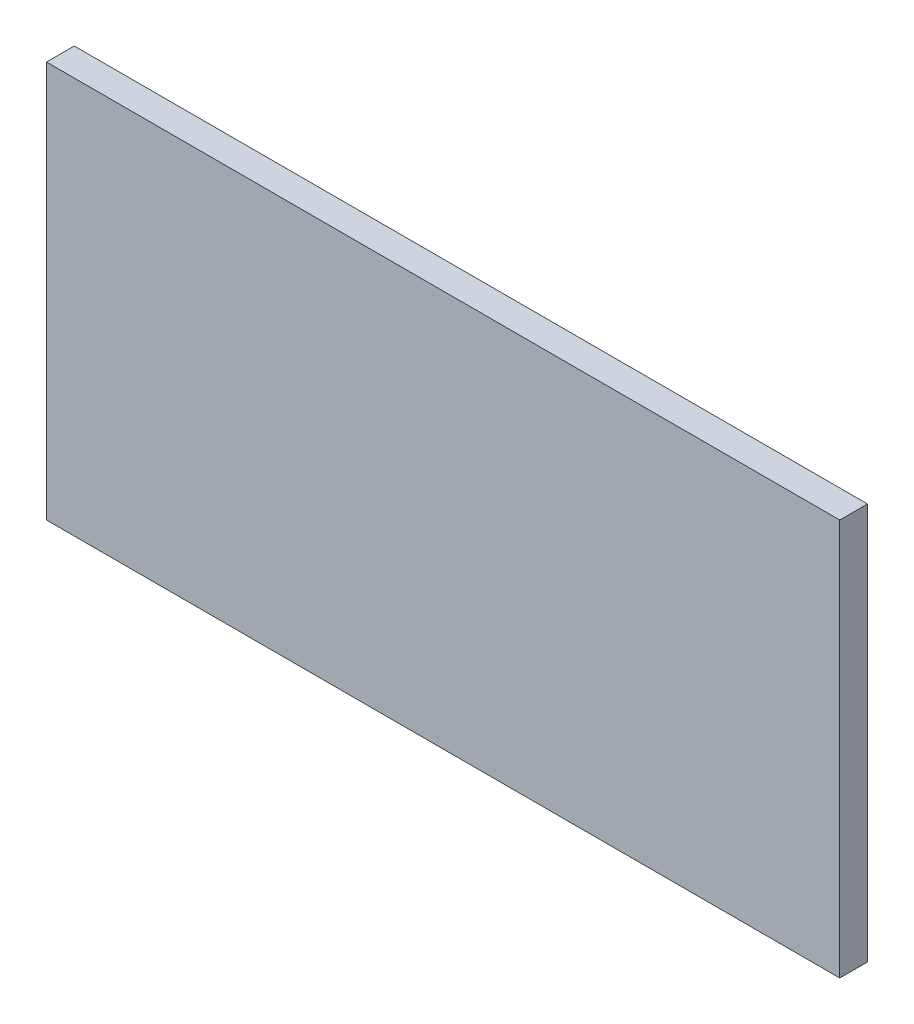
ISO-10303-21;
HEADER;
FILE_DESCRIPTION(('STEP AP214'),'2;1');
FILE_NAME('part.step','',(''),(''),'','','');
FILE_SCHEMA(('AUTOMOTIVE_DESIGN { 1 0 10303 214 1 1 1 1 }'));
ENDSEC;
DATA;
#1=APPLICATION_CONTEXT('core data for automotive mechanical design processes');
#2=APPLICATION_PROTOCOL_DEFINITION('international standard','automotive_design',2000,#1);
#3=PRODUCT_CONTEXT('',#1,'mechanical');
#4=PRODUCT('Part','Part','',(#3));
#5=PRODUCT_RELATED_PRODUCT_CATEGORY('part','',(#4));
#6=PRODUCT_DEFINITION_FORMATION('','',#4);
#7=PRODUCT_DEFINITION_CONTEXT('part definition',#1,'design');
#8=PRODUCT_DEFINITION('design','',#6,#7);
#9=PRODUCT_DEFINITION_SHAPE('','',#8);
#10=(LENGTH_UNIT() NAMED_UNIT(*) SI_UNIT(.MILLI.,.METRE.));
#11=(NAMED_UNIT(*) PLANE_ANGLE_UNIT() SI_UNIT($,.RADIAN.));
#12=(NAMED_UNIT(*) SI_UNIT($,.STERADIAN.) SOLID_ANGLE_UNIT());
#13=UNCERTAINTY_MEASURE_WITH_UNIT(LENGTH_MEASURE(1.E-05),#10,'distance_accuracy_value','');
#14=(GEOMETRIC_REPRESENTATION_CONTEXT(3) GLOBAL_UNCERTAINTY_ASSIGNED_CONTEXT((#13)) GLOBAL_UNIT_ASSIGNED_CONTEXT((#10,
#11,#12)) REPRESENTATION_CONTEXT('',''));
#15=CARTESIAN_POINT('',(0.,0.,0.));
#16=DIRECTION('',(0.,0.,1.));
#17=DIRECTION('',(1.,0.,0.));
#18=AXIS2_PLACEMENT_3D('',#15,#16,#17);
#19=CARTESIAN_POINT('',(78.46,-128.56,1.635));
#20=DIRECTION('',(0.,0.,-1.));
#21=DIRECTION('',(0.,-1.,0.));
#22=AXIS2_PLACEMENT_3D('',#19,#20,#21);
#23=PLANE('',#22);
#24=DIRECTION('',(0.,-1.,0.));
#25=VECTOR('',#24,1.);
#26=CARTESIAN_POINT('',(78.96,-128.31,1.635));
#27=LINE('',#26,#25);
#28=CARTESIAN_POINT('',(78.96,-128.31,1.635));
#29=VERTEX_POINT('',#28);
#30=CARTESIAN_POINT('',(78.96,-128.81,1.635));
#31=VERTEX_POINT('',#30);
#32=EDGE_CURVE('E27',#29,#31,#27,.T.);
#33=ORIENTED_EDGE('',*,*,#32,.F.);
#34=DIRECTION('',(1.,0.,0.));
#35=VECTOR('',#34,1.);
#36=CARTESIAN_POINT('',(77.96,-128.31,1.635));
#37=LINE('',#36,#35);
#38=CARTESIAN_POINT('',(77.96,-128.31,1.635));
#39=VERTEX_POINT('',#38);
#40=EDGE_CURVE('E95',#39,#29,#37,.T.);
#41=ORIENTED_EDGE('',*,*,#40,.F.);
#42=DIRECTION('',(0.,1.,0.));
#43=VECTOR('',#42,1.);
#44=CARTESIAN_POINT('',(77.96,-128.81,1.635));
#45=LINE('',#44,#43);
#46=CARTESIAN_POINT('',(77.96,-128.81,1.635));
#47=VERTEX_POINT('',#46);
#48=EDGE_CURVE('E79',#47,#39,#45,.T.);
#49=ORIENTED_EDGE('',*,*,#48,.F.);
#50=DIRECTION('',(-1.,0.,0.));
#51=VECTOR('',#50,1.);
#52=CARTESIAN_POINT('',(78.96,-128.81,1.635));
#53=LINE('',#52,#51);
#54=EDGE_CURVE('E84',#31,#47,#53,.T.);
#55=ORIENTED_EDGE('',*,*,#54,.F.);
#56=EDGE_LOOP('',(#33,#41,#49,#55));
#57=FACE_BOUND('',#56,.T.);
#58=ADVANCED_FACE('F17',(#57),#23,.F.);
#59=CARTESIAN_POINT('',(78.46,-128.56,1.6));
#60=DIRECTION('',(0.,0.,-1.));
#61=DIRECTION('',(0.,-1.,0.));
#62=AXIS2_PLACEMENT_3D('',#59,#60,#61);
#63=PLANE('',#62);
#64=DIRECTION('',(-1.,0.,0.));
#65=VECTOR('',#64,1.);
#66=CARTESIAN_POINT('',(78.96,-128.81,1.6));
#67=LINE('',#66,#65);
#68=CARTESIAN_POINT('',(78.96,-128.81,1.6));
#69=VERTEX_POINT('',#68);
#70=CARTESIAN_POINT('',(77.96,-128.81,1.6));
#71=VERTEX_POINT('',#70);
#72=EDGE_CURVE('E67',#69,#71,#67,.T.);
#73=ORIENTED_EDGE('',*,*,#72,.T.);
#74=DIRECTION('',(0.,1.,0.));
#75=VECTOR('',#74,1.);
#76=CARTESIAN_POINT('',(77.96,-128.81,1.6));
#77=LINE('',#76,#75);
#78=CARTESIAN_POINT('',(77.96,-128.31,1.6));
#79=VERTEX_POINT('',#78);
#80=EDGE_CURVE('E92',#71,#79,#77,.T.);
#81=ORIENTED_EDGE('',*,*,#80,.T.);
#82=DIRECTION('',(1.,0.,0.));
#83=VECTOR('',#82,1.);
#84=CARTESIAN_POINT('',(77.96,-128.31,1.6));
#85=LINE('',#84,#83);
#86=CARTESIAN_POINT('',(78.96,-128.31,1.6));
#87=VERTEX_POINT('',#86);
#88=EDGE_CURVE('E69',#79,#87,#85,.T.);
#89=ORIENTED_EDGE('',*,*,#88,.T.);
#90=DIRECTION('',(0.,-1.,0.));
#91=VECTOR('',#90,1.);
#92=CARTESIAN_POINT('',(78.96,-128.31,1.6));
#93=LINE('',#92,#91);
#94=EDGE_CURVE('E11',#87,#69,#93,.T.);
#95=ORIENTED_EDGE('',*,*,#94,.T.);
#96=EDGE_LOOP('',(#73,#81,#89,#95));
#97=FACE_BOUND('',#96,.T.);
#98=ADVANCED_FACE('F19',(#97),#63,.T.);
#99=CARTESIAN_POINT('',(78.96,-128.31,1.6));
#100=DIRECTION('',(1.,0.,0.));
#101=DIRECTION('',(0.,1.,0.));
#102=AXIS2_PLACEMENT_3D('',#99,#100,#101);
#103=PLANE('',#102);
#104=DIRECTION('',(0.,0.,1.));
#105=VECTOR('',#104,1.);
#106=CARTESIAN_POINT('',(78.96,-128.31,1.6));
#107=LINE('',#106,#105);
#108=EDGE_CURVE('E99',#87,#29,#107,.T.);
#109=ORIENTED_EDGE('',*,*,#108,.T.);
#110=ORIENTED_EDGE('',*,*,#32,.T.);
#111=DIRECTION('',(0.,0.,1.));
#112=VECTOR('',#111,1.);
#113=CARTESIAN_POINT('',(78.96,-128.81,1.6));
#114=LINE('',#113,#112);
#115=EDGE_CURVE('E75',#69,#31,#114,.T.);
#116=ORIENTED_EDGE('',*,*,#115,.F.);
#117=ORIENTED_EDGE('',*,*,#94,.F.);
#118=EDGE_LOOP('',(#109,#110,#116,#117));
#119=FACE_BOUND('',#118,.T.);
#120=ADVANCED_FACE('F81',(#119),#103,.T.);
#121=CARTESIAN_POINT('',(77.96,-128.31,1.6));
#122=DIRECTION('',(0.,1.,0.));
#123=DIRECTION('',(1.,0.,0.));
#124=AXIS2_PLACEMENT_3D('',#121,#122,#123);
#125=PLANE('',#124);
#126=DIRECTION('',(0.,0.,1.));
#127=VECTOR('',#126,1.);
#128=CARTESIAN_POINT('',(77.96,-128.31,1.6));
#129=LINE('',#128,#127);
#130=EDGE_CURVE('E96',#79,#39,#129,.T.);
#131=ORIENTED_EDGE('',*,*,#130,.T.);
#132=ORIENTED_EDGE('',*,*,#40,.T.);
#133=ORIENTED_EDGE('',*,*,#108,.F.);
#134=ORIENTED_EDGE('',*,*,#88,.F.);
#135=EDGE_LOOP('',(#131,#132,#133,#134));
#136=FACE_BOUND('',#135,.T.);
#137=ADVANCED_FACE('F166',(#136),#125,.T.);
#138=CARTESIAN_POINT('',(77.96,-128.81,1.6));
#139=DIRECTION('',(-1.,0.,0.));
#140=DIRECTION('',(0.,0.,1.));
#141=AXIS2_PLACEMENT_3D('',#138,#139,#140);
#142=PLANE('',#141);
#143=DIRECTION('',(0.,0.,1.));
#144=VECTOR('',#143,1.);
#145=CARTESIAN_POINT('',(77.96,-128.81,1.6));
#146=LINE('',#145,#144);
#147=EDGE_CURVE('E77',#71,#47,#146,.T.);
#148=ORIENTED_EDGE('',*,*,#147,.T.);
#149=ORIENTED_EDGE('',*,*,#48,.T.);
#150=ORIENTED_EDGE('',*,*,#130,.F.);
#151=ORIENTED_EDGE('',*,*,#80,.F.);
#152=EDGE_LOOP('',(#148,#149,#150,#151));
#153=FACE_BOUND('',#152,.T.);
#154=ADVANCED_FACE('F156',(#153),#142,.T.);
#155=CARTESIAN_POINT('',(78.96,-128.81,1.6));
#156=DIRECTION('',(0.,-1.,0.));
#157=DIRECTION('',(0.,0.,-1.));
#158=AXIS2_PLACEMENT_3D('',#155,#156,#157);
#159=PLANE('',#158);
#160=ORIENTED_EDGE('',*,*,#115,.T.);
#161=ORIENTED_EDGE('',*,*,#54,.T.);
#162=ORIENTED_EDGE('',*,*,#147,.F.);
#163=ORIENTED_EDGE('',*,*,#72,.F.);
#164=EDGE_LOOP('',(#160,#161,#162,#163));
#165=FACE_BOUND('',#164,.T.);
#166=ADVANCED_FACE('F73',(#165),#159,.T.);
#167=CLOSED_SHELL('',(#58,#98,#120,#137,#154,#166));
#168=MANIFOLD_SOLID_BREP('B1',#167);
#169=ADVANCED_BREP_SHAPE_REPRESENTATION('',(#18,#168),#14);
#170=SHAPE_DEFINITION_REPRESENTATION(#9,#169);
ENDSEC;
END-ISO-10303-21;
